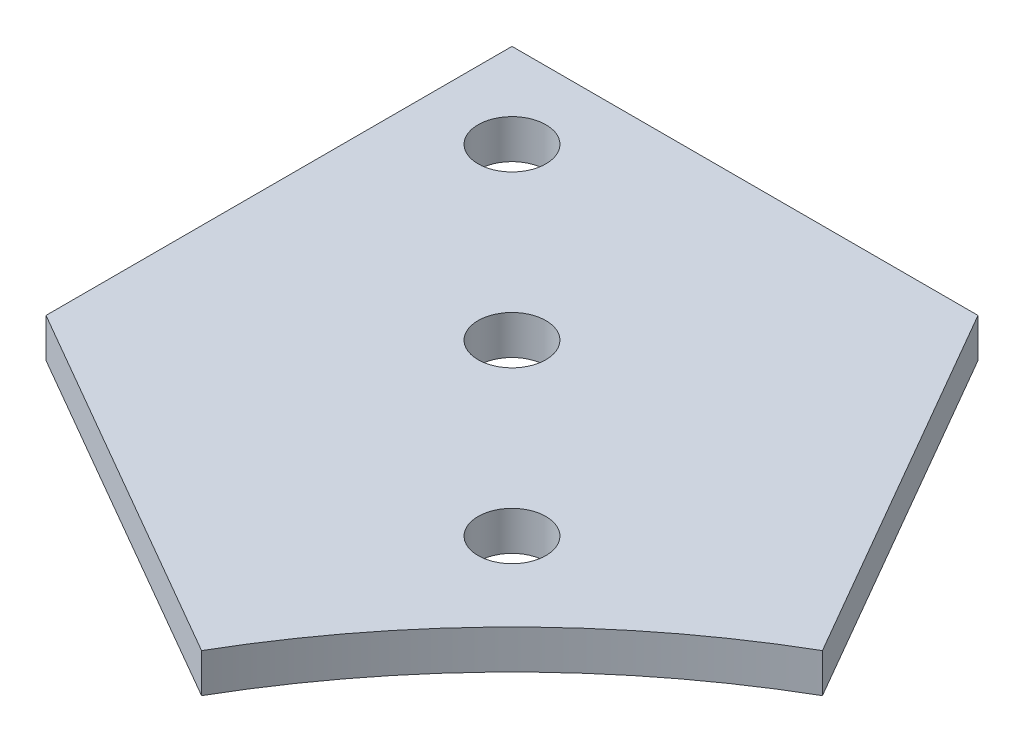
ISO-10303-21;
HEADER;
FILE_DESCRIPTION(('STEP AP214'),'2;1');
FILE_NAME('part.step','',(''),(''),'','','');
FILE_SCHEMA(('AUTOMOTIVE_DESIGN { 1 0 10303 214 1 1 1 1 }'));
ENDSEC;
DATA;
#1=APPLICATION_CONTEXT('core data for automotive mechanical design processes');
#2=APPLICATION_PROTOCOL_DEFINITION('international standard','automotive_design',2000,#1);
#3=PRODUCT_CONTEXT('',#1,'mechanical');
#4=PRODUCT('Part','Part','',(#3));
#5=PRODUCT_RELATED_PRODUCT_CATEGORY('part','',(#4));
#6=PRODUCT_DEFINITION_FORMATION('','',#4);
#7=PRODUCT_DEFINITION_CONTEXT('part definition',#1,'design');
#8=PRODUCT_DEFINITION('design','',#6,#7);
#9=PRODUCT_DEFINITION_SHAPE('','',#8);
#10=(LENGTH_UNIT() NAMED_UNIT(*) SI_UNIT(.MILLI.,.METRE.));
#11=(NAMED_UNIT(*) PLANE_ANGLE_UNIT() SI_UNIT($,.RADIAN.));
#12=(NAMED_UNIT(*) SI_UNIT($,.STERADIAN.) SOLID_ANGLE_UNIT());
#13=UNCERTAINTY_MEASURE_WITH_UNIT(LENGTH_MEASURE(1.E-05),#10,'distance_accuracy_value','');
#14=(GEOMETRIC_REPRESENTATION_CONTEXT(3) GLOBAL_UNCERTAINTY_ASSIGNED_CONTEXT((#13)) GLOBAL_UNIT_ASSIGNED_CONTEXT((#10,
#11,#12)) REPRESENTATION_CONTEXT('',''));
#15=CARTESIAN_POINT('',(0.,0.,0.));
#16=DIRECTION('',(0.,0.,1.));
#17=DIRECTION('',(1.,0.,0.));
#18=AXIS2_PLACEMENT_3D('',#15,#16,#17);
#19=CARTESIAN_POINT('',(-65.,2.3,-37.5277674973262));
#20=DIRECTION('',(1.,0.,0.));
#21=DIRECTION('',(0.,0.,-1.));
#22=AXIS2_PLACEMENT_3D('',#19,#20,#21);
#23=PLANE('',#22);
#24=DIRECTION('',(0.,0.,1.));
#25=VECTOR('',#24,1.);
#26=CARTESIAN_POINT('',(-65.,0.,-37.5277674973262));
#27=LINE('',#26,#25);
#28=CARTESIAN_POINT('',(-65.,0.,-65.));
#29=VERTEX_POINT('',#28);
#30=CARTESIAN_POINT('',(-65.,0.,-37.5277674973262));
#31=VERTEX_POINT('',#30);
#32=EDGE_CURVE('E115',#29,#31,#27,.T.);
#33=ORIENTED_EDGE('',*,*,#32,.T.);
#34=DIRECTION('',(0.,-1.,0.));
#35=VECTOR('',#34,1.);
#36=CARTESIAN_POINT('',(-65.,2.3,-37.5277674973262));
#37=LINE('',#36,#35);
#38=CARTESIAN_POINT('',(-65.,2.3,-37.5277674973262));
#39=VERTEX_POINT('',#38);
#40=EDGE_CURVE('E12',#39,#31,#37,.T.);
#41=ORIENTED_EDGE('',*,*,#40,.F.);
#42=DIRECTION('',(0.,0.,1.));
#43=VECTOR('',#42,1.);
#44=CARTESIAN_POINT('',(-65.,2.3,-37.5277674973262));
#45=LINE('',#44,#43);
#46=CARTESIAN_POINT('',(-65.,2.3,-65.));
#47=VERTEX_POINT('',#46);
#48=EDGE_CURVE('E113',#47,#39,#45,.T.);
#49=ORIENTED_EDGE('',*,*,#48,.F.);
#50=DIRECTION('',(0.,-1.,0.));
#51=VECTOR('',#50,1.);
#52=CARTESIAN_POINT('',(-65.,2.3,-65.));
#53=LINE('',#52,#51);
#54=EDGE_CURVE('E119',#47,#29,#53,.T.);
#55=ORIENTED_EDGE('',*,*,#54,.T.);
#56=EDGE_LOOP('',(#33,#41,#49,#55));
#57=FACE_BOUND('',#56,.T.);
#58=ADVANCED_FACE('F38',(#57),#23,.F.);
#59=CARTESIAN_POINT('',(-43.3012701892218,2.3,-25.0000000000003));
#60=DIRECTION('',(0.500000000000006,0.,-0.866025403784435));
#61=DIRECTION('',(-0.866025403784435,0.,-0.500000000000006));
#62=AXIS2_PLACEMENT_3D('',#59,#60,#61);
#63=PLANE('',#62);
#64=DIRECTION('',(0.866025403784435,0.,0.500000000000006));
#65=VECTOR('',#64,1.);
#66=CARTESIAN_POINT('',(-43.3012701892218,0.,-25.0000000000003));
#67=LINE('',#66,#65);
#68=CARTESIAN_POINT('',(-43.3012701892218,0.,-25.0000000000003));
#69=VERTEX_POINT('',#68);
#70=EDGE_CURVE('E111',#31,#69,#67,.T.);
#71=ORIENTED_EDGE('',*,*,#70,.T.);
#72=DIRECTION('',(0.,-1.,0.));
#73=VECTOR('',#72,1.);
#74=CARTESIAN_POINT('',(-43.3012701892218,2.3,-25.0000000000003));
#75=LINE('',#74,#73);
#76=CARTESIAN_POINT('',(-43.3012701892218,2.3,-25.0000000000003));
#77=VERTEX_POINT('',#76);
#78=EDGE_CURVE('E46',#77,#69,#75,.T.);
#79=ORIENTED_EDGE('',*,*,#78,.F.);
#80=DIRECTION('',(0.866025403784435,0.,0.500000000000006));
#81=VECTOR('',#80,1.);
#82=CARTESIAN_POINT('',(-43.3012701892218,2.3,-25.0000000000003));
#83=LINE('',#82,#81);
#84=EDGE_CURVE('E83',#39,#77,#83,.T.);
#85=ORIENTED_EDGE('',*,*,#84,.F.);
#86=ORIENTED_EDGE('',*,*,#40,.T.);
#87=EDGE_LOOP('',(#71,#79,#85,#86));
#88=FACE_BOUND('',#87,.T.);
#89=ADVANCED_FACE('F161',(#88),#63,.F.);
#90=CARTESIAN_POINT('',(-37.5277674973262,2.3,-65.));
#91=DIRECTION('',(-0.866025403784435,0.,0.500000000000006));
#92=DIRECTION('',(0.500000000000006,0.,0.866025403784435));
#93=AXIS2_PLACEMENT_3D('',#90,#91,#92);
#94=PLANE('',#93);
#95=DIRECTION('',(-0.500000000000006,0.,-0.866025403784435));
#96=VECTOR('',#95,1.);
#97=CARTESIAN_POINT('',(-37.5277674973262,0.,-65.));
#98=LINE('',#97,#96);
#99=CARTESIAN_POINT('',(-25.0000000000003,0.,-43.3012701892218));
#100=VERTEX_POINT('',#99);
#101=CARTESIAN_POINT('',(-37.5277674973262,0.,-65.));
#102=VERTEX_POINT('',#101);
#103=EDGE_CURVE('E72',#100,#102,#98,.T.);
#104=ORIENTED_EDGE('',*,*,#103,.T.);
#105=DIRECTION('',(0.,-1.,0.));
#106=VECTOR('',#105,1.);
#107=CARTESIAN_POINT('',(-37.5277674973262,2.3,-65.));
#108=LINE('',#107,#106);
#109=CARTESIAN_POINT('',(-37.5277674973262,2.3,-65.));
#110=VERTEX_POINT('',#109);
#111=EDGE_CURVE('E106',#110,#102,#108,.T.);
#112=ORIENTED_EDGE('',*,*,#111,.F.);
#113=DIRECTION('',(-0.500000000000006,0.,-0.866025403784435));
#114=VECTOR('',#113,1.);
#115=CARTESIAN_POINT('',(-37.5277674973262,2.3,-65.));
#116=LINE('',#115,#114);
#117=CARTESIAN_POINT('',(-25.0000000000003,2.3,-43.3012701892218));
#118=VERTEX_POINT('',#117);
#119=EDGE_CURVE('E105',#118,#110,#116,.T.);
#120=ORIENTED_EDGE('',*,*,#119,.F.);
#121=DIRECTION('',(0.,-1.,0.));
#122=VECTOR('',#121,1.);
#123=CARTESIAN_POINT('',(-25.0000000000003,2.3,-43.3012701892218));
#124=LINE('',#123,#122);
#125=EDGE_CURVE('E96',#118,#100,#124,.T.);
#126=ORIENTED_EDGE('',*,*,#125,.T.);
#127=EDGE_LOOP('',(#104,#112,#120,#126));
#128=FACE_BOUND('',#127,.T.);
#129=ADVANCED_FACE('F104',(#128),#94,.F.);
#130=CARTESIAN_POINT('',(-65.,2.3,-65.));
#131=DIRECTION('',(0.,0.,1.));
#132=DIRECTION('',(1.,0.,0.));
#133=AXIS2_PLACEMENT_3D('',#130,#131,#132);
#134=PLANE('',#133);
#135=DIRECTION('',(-1.,0.,0.));
#136=VECTOR('',#135,1.);
#137=CARTESIAN_POINT('',(-65.,0.,-65.));
#138=LINE('',#137,#136);
#139=EDGE_CURVE('E77',#102,#29,#138,.T.);
#140=ORIENTED_EDGE('',*,*,#139,.T.);
#141=ORIENTED_EDGE('',*,*,#54,.F.);
#142=DIRECTION('',(-1.,0.,0.));
#143=VECTOR('',#142,1.);
#144=CARTESIAN_POINT('',(-65.,2.3,-65.));
#145=LINE('',#144,#143);
#146=EDGE_CURVE('E54',#110,#47,#145,.T.);
#147=ORIENTED_EDGE('',*,*,#146,.F.);
#148=ORIENTED_EDGE('',*,*,#111,.T.);
#149=EDGE_LOOP('',(#140,#141,#147,#148));
#150=FACE_BOUND('',#149,.T.);
#151=ADVANCED_FACE('F121',(#150),#134,.F.);
#152=CARTESIAN_POINT('',(0.,2.3,0.));
#153=DIRECTION('',(0.,-1.,0.));
#154=DIRECTION('',(0.,0.,-1.));
#155=AXIS2_PLACEMENT_3D('',#152,#153,#154);
#156=PLANE('',#155);
#157=CARTESIAN_POINT('',(-60.,2.3,-60.));
#158=DIRECTION('',(0.,1.,0.));
#159=DIRECTION('',(0.,0.,1.));
#160=AXIS2_PLACEMENT_3D('',#157,#158,#159);
#161=CIRCLE('',#160,2.);
#162=CARTESIAN_POINT('',(-60.,2.3,-58.));
#163=VERTEX_POINT('',#162);
#164=EDGE_CURVE('E143',#163,#163,#161,.T.);
#165=ORIENTED_EDGE('',*,*,#164,.F.);
#166=EDGE_LOOP('',(#165));
#167=FACE_BOUND('',#166,.T.);
#168=CARTESIAN_POINT('',(-40.,2.3,-40.));
#169=DIRECTION('',(0.,1.,0.));
#170=DIRECTION('',(0.,0.,1.));
#171=AXIS2_PLACEMENT_3D('',#168,#169,#170);
#172=CIRCLE('',#171,2.);
#173=CARTESIAN_POINT('',(-40.,2.3,-38.));
#174=VERTEX_POINT('',#173);
#175=EDGE_CURVE('E100',#174,#174,#172,.T.);
#176=ORIENTED_EDGE('',*,*,#175,.F.);
#177=EDGE_LOOP('',(#176));
#178=FACE_BOUND('',#177,.T.);
#179=CARTESIAN_POINT('',(-50.,2.3,-50.));
#180=DIRECTION('',(0.,1.,0.));
#181=DIRECTION('',(0.,0.,1.));
#182=AXIS2_PLACEMENT_3D('',#179,#180,#181);
#183=CIRCLE('',#182,2.);
#184=CARTESIAN_POINT('',(-50.,2.3,-48.));
#185=VERTEX_POINT('',#184);
#186=EDGE_CURVE('E144',#185,#185,#183,.T.);
#187=ORIENTED_EDGE('',*,*,#186,.F.);
#188=EDGE_LOOP('',(#187));
#189=FACE_BOUND('',#188,.T.);
#190=ORIENTED_EDGE('',*,*,#84,.T.);
#191=CARTESIAN_POINT('',(0.,2.3,0.));
#192=DIRECTION('',(0.,1.,0.));
#193=DIRECTION('',(0.,0.,1.));
#194=AXIS2_PLACEMENT_3D('',#191,#192,#193);
#195=CIRCLE('',#194,50.);
#196=EDGE_CURVE('E101',#118,#77,#195,.T.);
#197=ORIENTED_EDGE('',*,*,#196,.F.);
#198=ORIENTED_EDGE('',*,*,#119,.T.);
#199=ORIENTED_EDGE('',*,*,#146,.T.);
#200=ORIENTED_EDGE('',*,*,#48,.T.);
#201=EDGE_LOOP('',(#190,#197,#198,#199,#200));
#202=FACE_BOUND('',#201,.T.);
#203=ADVANCED_FACE('F159',(#167,#178,#189,#202),#156,.F.);
#204=CARTESIAN_POINT('',(0.,0.,0.));
#205=DIRECTION('',(0.,-1.,0.));
#206=DIRECTION('',(0.,0.,-1.));
#207=AXIS2_PLACEMENT_3D('',#204,#205,#206);
#208=PLANE('',#207);
#209=CARTESIAN_POINT('',(-60.,0.,-60.));
#210=DIRECTION('',(0.,1.,0.));
#211=DIRECTION('',(0.,0.,1.));
#212=AXIS2_PLACEMENT_3D('',#209,#210,#211);
#213=CIRCLE('',#212,2.);
#214=CARTESIAN_POINT('',(-60.,0.,-58.));
#215=VERTEX_POINT('',#214);
#216=EDGE_CURVE('E164',#215,#215,#213,.T.);
#217=ORIENTED_EDGE('',*,*,#216,.T.);
#218=EDGE_LOOP('',(#217));
#219=FACE_BOUND('',#218,.T.);
#220=CARTESIAN_POINT('',(0.,0.,0.));
#221=DIRECTION('',(0.,1.,0.));
#222=DIRECTION('',(0.,0.,1.));
#223=AXIS2_PLACEMENT_3D('',#220,#221,#222);
#224=CIRCLE('',#223,50.);
#225=EDGE_CURVE('E94',#100,#69,#224,.T.);
#226=ORIENTED_EDGE('',*,*,#225,.T.);
#227=ORIENTED_EDGE('',*,*,#70,.F.);
#228=ORIENTED_EDGE('',*,*,#32,.F.);
#229=ORIENTED_EDGE('',*,*,#139,.F.);
#230=ORIENTED_EDGE('',*,*,#103,.F.);
#231=EDGE_LOOP('',(#226,#227,#228,#229,#230));
#232=FACE_BOUND('',#231,.T.);
#233=CARTESIAN_POINT('',(-40.,0.,-40.));
#234=DIRECTION('',(0.,1.,0.));
#235=DIRECTION('',(0.,0.,1.));
#236=AXIS2_PLACEMENT_3D('',#233,#234,#235);
#237=CIRCLE('',#236,2.);
#238=CARTESIAN_POINT('',(-40.,0.,-38.));
#239=VERTEX_POINT('',#238);
#240=EDGE_CURVE('E149',#239,#239,#237,.T.);
#241=ORIENTED_EDGE('',*,*,#240,.T.);
#242=EDGE_LOOP('',(#241));
#243=FACE_BOUND('',#242,.T.);
#244=CARTESIAN_POINT('',(-50.,0.,-50.));
#245=DIRECTION('',(0.,1.,0.));
#246=DIRECTION('',(0.,0.,1.));
#247=AXIS2_PLACEMENT_3D('',#244,#245,#246);
#248=CIRCLE('',#247,2.);
#249=CARTESIAN_POINT('',(-50.,0.,-48.));
#250=VERTEX_POINT('',#249);
#251=EDGE_CURVE('E140',#250,#250,#248,.T.);
#252=ORIENTED_EDGE('',*,*,#251,.T.);
#253=EDGE_LOOP('',(#252));
#254=FACE_BOUND('',#253,.T.);
#255=ADVANCED_FACE('F108',(#219,#232,#243,#254),#208,.T.);
#256=CARTESIAN_POINT('',(-50.,0.,-50.));
#257=DIRECTION('',(0.,1.,0.));
#258=DIRECTION('',(0.,0.,1.));
#259=AXIS2_PLACEMENT_3D('',#256,#257,#258);
#260=CYLINDRICAL_SURFACE('',#259,2.);
#261=ORIENTED_EDGE('',*,*,#251,.F.);
#262=EDGE_LOOP('',(#261));
#263=FACE_BOUND('',#262,.T.);
#264=ORIENTED_EDGE('',*,*,#186,.T.);
#265=EDGE_LOOP('',(#264));
#266=FACE_BOUND('',#265,.T.);
#267=ADVANCED_FACE('F183',(#263,#266),#260,.F.);
#268=CARTESIAN_POINT('',(-40.,0.,-40.));
#269=DIRECTION('',(0.,1.,0.));
#270=DIRECTION('',(0.,0.,1.));
#271=AXIS2_PLACEMENT_3D('',#268,#269,#270);
#272=CYLINDRICAL_SURFACE('',#271,2.);
#273=ORIENTED_EDGE('',*,*,#240,.F.);
#274=EDGE_LOOP('',(#273));
#275=FACE_BOUND('',#274,.T.);
#276=ORIENTED_EDGE('',*,*,#175,.T.);
#277=EDGE_LOOP('',(#276));
#278=FACE_BOUND('',#277,.T.);
#279=ADVANCED_FACE('F185',(#275,#278),#272,.F.);
#280=CARTESIAN_POINT('',(0.,0.,0.));
#281=DIRECTION('',(0.,1.,0.));
#282=DIRECTION('',(0.,0.,1.));
#283=AXIS2_PLACEMENT_3D('',#280,#281,#282);
#284=CYLINDRICAL_SURFACE('',#283,50.);
#285=ORIENTED_EDGE('',*,*,#225,.F.);
#286=ORIENTED_EDGE('',*,*,#125,.F.);
#287=ORIENTED_EDGE('',*,*,#196,.T.);
#288=ORIENTED_EDGE('',*,*,#78,.T.);
#289=EDGE_LOOP('',(#285,#286,#287,#288));
#290=FACE_BOUND('',#289,.T.);
#291=ADVANCED_FACE('F95',(#290),#284,.F.);
#292=CARTESIAN_POINT('',(-60.,0.,-60.));
#293=DIRECTION('',(0.,1.,0.));
#294=DIRECTION('',(0.,0.,1.));
#295=AXIS2_PLACEMENT_3D('',#292,#293,#294);
#296=CYLINDRICAL_SURFACE('',#295,2.);
#297=ORIENTED_EDGE('',*,*,#216,.F.);
#298=EDGE_LOOP('',(#297));
#299=FACE_BOUND('',#298,.T.);
#300=ORIENTED_EDGE('',*,*,#164,.T.);
#301=EDGE_LOOP('',(#300));
#302=FACE_BOUND('',#301,.T.);
#303=ADVANCED_FACE('F174',(#299,#302),#296,.F.);
#304=CLOSED_SHELL('',(#58,#89,#129,#151,#203,#255,#267,#279,#291,#303));
#305=MANIFOLD_SOLID_BREP('B2',#304);
#306=ADVANCED_BREP_SHAPE_REPRESENTATION('',(#18,#305),#14);
#307=SHAPE_DEFINITION_REPRESENTATION(#9,#306);
ENDSEC;
END-ISO-10303-21;
